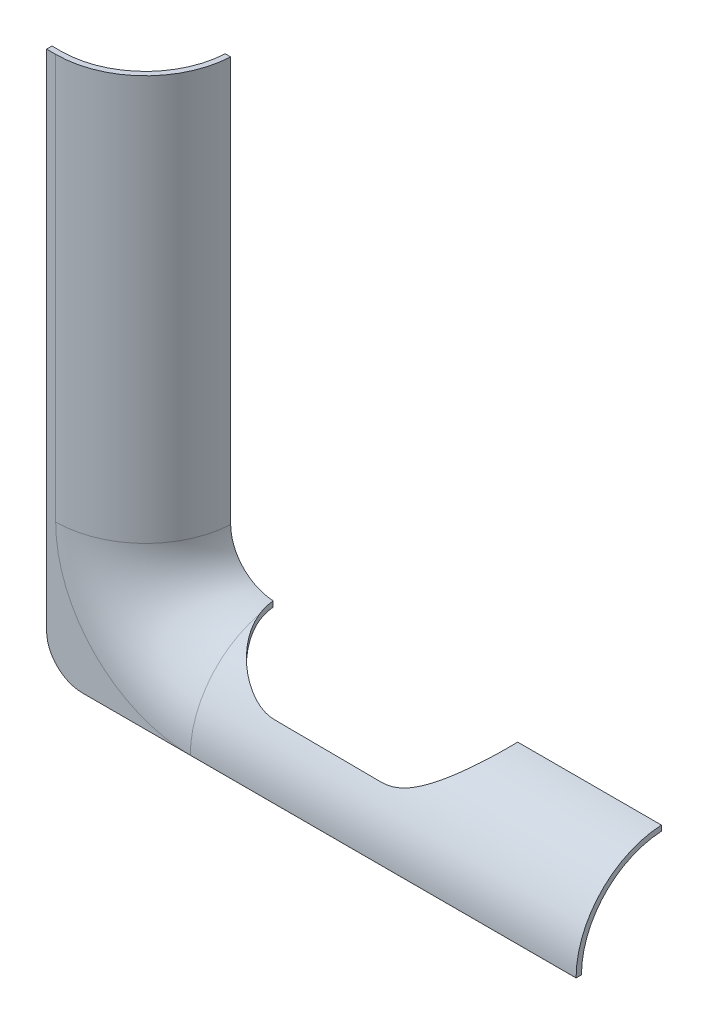
ISO-10303-21;
HEADER;
FILE_DESCRIPTION(('STEP AP214'),'2;1');
FILE_NAME('part.step','',(''),(''),'','','');
FILE_SCHEMA(('AUTOMOTIVE_DESIGN { 1 0 10303 214 1 1 1 1 }'));
ENDSEC;
DATA;
#1=APPLICATION_CONTEXT('core data for automotive mechanical design processes');
#2=APPLICATION_PROTOCOL_DEFINITION('international standard','automotive_design',2000,#1);
#3=PRODUCT_CONTEXT('',#1,'mechanical');
#4=PRODUCT('Part','Part','',(#3));
#5=PRODUCT_RELATED_PRODUCT_CATEGORY('part','',(#4));
#6=PRODUCT_DEFINITION_FORMATION('','',#4);
#7=PRODUCT_DEFINITION_CONTEXT('part definition',#1,'design');
#8=PRODUCT_DEFINITION('design','',#6,#7);
#9=PRODUCT_DEFINITION_SHAPE('','',#8);
#10=(LENGTH_UNIT() NAMED_UNIT(*) SI_UNIT(.MILLI.,.METRE.));
#11=(NAMED_UNIT(*) PLANE_ANGLE_UNIT() SI_UNIT($,.RADIAN.));
#12=(NAMED_UNIT(*) SI_UNIT($,.STERADIAN.) SOLID_ANGLE_UNIT());
#13=UNCERTAINTY_MEASURE_WITH_UNIT(LENGTH_MEASURE(1.E-05),#10,'distance_accuracy_value','');
#14=(GEOMETRIC_REPRESENTATION_CONTEXT(3) GLOBAL_UNCERTAINTY_ASSIGNED_CONTEXT((#13)) GLOBAL_UNIT_ASSIGNED_CONTEXT((#10,
#11,#12)) REPRESENTATION_CONTEXT('',''));
#15=CARTESIAN_POINT('',(0.,0.,0.));
#16=DIRECTION('',(0.,0.,1.));
#17=DIRECTION('',(1.,0.,0.));
#18=AXIS2_PLACEMENT_3D('',#15,#16,#17);
#19=CARTESIAN_POINT('',(-72.7315150821701,-736.702863061255,0.));
#20=DIRECTION('',(0.,0.,1.));
#21=DIRECTION('',(1.,0.,0.));
#22=AXIS2_PLACEMENT_3D('',#19,#20,#21);
#23=PLANE('',#22);
#24=CARTESIAN_POINT('',(-48.7380579076772,-714.702863061255,0.));
#25=DIRECTION('',(0.,0.,1.));
#26=DIRECTION('',(1.,0.,0.));
#27=AXIS2_PLACEMENT_3D('',#24,#25,#26);
#28=CIRCLE('',#27,10.);
#29=CARTESIAN_POINT('',(-58.7380579076772,-714.702863061255,0.));
#30=VERTEX_POINT('',#29);
#31=CARTESIAN_POINT('',(-49.2608688373416,-724.689187146313,0.));
#32=VERTEX_POINT('',#31);
#33=EDGE_CURVE('E306',#30,#32,#28,.T.);
#34=ORIENTED_EDGE('',*,*,#33,.T.);
#35=DIRECTION('',(0.,1.,0.));
#36=VECTOR('',#35,1.);
#37=CARTESIAN_POINT('',(-49.2608688373416,-744.703863061255,0.));
#38=LINE('',#37,#36);
#39=CARTESIAN_POINT('',(-49.2608688373416,-725.892254801583,0.));
#40=VERTEX_POINT('',#39);
#41=EDGE_CURVE('E176',#32,#40,#38,.F.);
#42=ORIENTED_EDGE('',*,*,#41,.T.);
#43=CARTESIAN_POINT('',(-48.7380579076772,-714.702863061255,0.));
#44=DIRECTION('',(0.,0.,1.));
#45=DIRECTION('',(1.,0.,0.));
#46=AXIS2_PLACEMENT_3D('',#43,#44,#45);
#47=CIRCLE('',#46,11.2015989388438);
#48=CARTESIAN_POINT('',(-59.939656846521,-714.702863061255,0.));
#49=VERTEX_POINT('',#48);
#50=EDGE_CURVE('E240',#49,#40,#47,.T.);
#51=ORIENTED_EDGE('',*,*,#50,.F.);
#52=DIRECTION('',(0.,1.,0.));
#53=VECTOR('',#52,1.);
#54=CARTESIAN_POINT('',(-59.939656846521,-714.702863061255,0.));
#55=LINE('',#54,#53);
#56=CARTESIAN_POINT('',(-59.939656846521,-624.514694799975,0.));
#57=VERTEX_POINT('',#56);
#58=EDGE_CURVE('E253',#49,#57,#55,.T.);
#59=ORIENTED_EDGE('',*,*,#58,.T.);
#60=DIRECTION('',(-1.,0.,0.));
#61=VECTOR('',#60,1.);
#62=CARTESIAN_POINT('',(-80.7315150821701,-624.514694799975,0.));
#63=LINE('',#62,#61);
#64=CARTESIAN_POINT('',(-58.7380579076772,-624.514694799975,0.));
#65=VERTEX_POINT('',#64);
#66=EDGE_CURVE('E275',#65,#57,#63,.T.);
#67=ORIENTED_EDGE('',*,*,#66,.F.);
#68=DIRECTION('',(0.,1.,0.));
#69=VECTOR('',#68,1.);
#70=CARTESIAN_POINT('',(-58.7380579076772,-724.702863061255,0.));
#71=LINE('',#70,#69);
#72=EDGE_CURVE('E290',#30,#65,#71,.T.);
#73=ORIENTED_EDGE('',*,*,#72,.F.);
#74=EDGE_LOOP('',(#34,#42,#51,#59,#67,#73));
#75=FACE_BOUND('',#74,.T.);
#76=ADVANCED_FACE('F34',(#75),#23,.F.);
#77=CARTESIAN_POINT('',(37.1804849178299,-744.702863061255,19.));
#78=DIRECTION('',(-1.,0.,0.));
#79=DIRECTION('',(0.,0.,1.));
#80=AXIS2_PLACEMENT_3D('',#77,#78,#79);
#81=PLANE('',#80);
#82=CARTESIAN_POINT('',(37.1804849178299,-744.677847416693,-0.999999999999994));
#83=DIRECTION('',(-1.,0.,0.));
#84=DIRECTION('',(0.,0.,1.));
#85=AXIS2_PLACEMENT_3D('',#82,#83,#84);
#86=CIRCLE('',#85,18.8);
#87=CARTESIAN_POINT('',(37.1804849178299,-725.904462000098,0.));
#88=VERTEX_POINT('',#87);
#89=CARTESIAN_POINT('',(37.1804849178299,-744.677847416693,17.8));
#90=VERTEX_POINT('',#89);
#91=EDGE_CURVE('E252',#88,#90,#86,.F.);
#92=ORIENTED_EDGE('',*,*,#91,.F.);
#93=DIRECTION('',(0.,1.,0.));
#94=VECTOR('',#93,1.);
#95=CARTESIAN_POINT('',(37.1804849178299,-744.702863061255,0.));
#96=LINE('',#95,#94);
#97=CARTESIAN_POINT('',(37.1804849178299,-724.702863061255,0.));
#98=VERTEX_POINT('',#97);
#99=EDGE_CURVE('E284',#88,#98,#96,.T.);
#100=ORIENTED_EDGE('',*,*,#99,.T.);
#101=CARTESIAN_POINT('',(37.1804849178299,-744.677847416693,-0.999999999999994));
#102=DIRECTION('',(-1.,0.,0.));
#103=DIRECTION('',(0.,0.,1.));
#104=AXIS2_PLACEMENT_3D('',#101,#102,#103);
#105=CIRCLE('',#104,20.);
#106=CARTESIAN_POINT('',(37.1804849178299,-744.677847416693,19.));
#107=VERTEX_POINT('',#106);
#108=EDGE_CURVE('E49',#98,#107,#105,.F.);
#109=ORIENTED_EDGE('',*,*,#108,.T.);
#110=DIRECTION('',(0.,1.,0.));
#111=VECTOR('',#110,1.);
#112=CARTESIAN_POINT('',(37.1804849178299,-744.702863061255,19.));
#113=LINE('',#112,#111);
#114=CARTESIAN_POINT('',(37.1804849178299,-744.702863061255,19.));
#115=VERTEX_POINT('',#114);
#116=EDGE_CURVE('E271',#115,#107,#113,.T.);
#117=ORIENTED_EDGE('',*,*,#116,.F.);
#118=DIRECTION('',(0.,0.,-1.));
#119=VECTOR('',#118,1.);
#120=CARTESIAN_POINT('',(37.1804849178299,-744.702863061255,19.));
#121=LINE('',#120,#119);
#122=CARTESIAN_POINT('',(37.1804849178299,-744.702863061255,17.8));
#123=VERTEX_POINT('',#122);
#124=EDGE_CURVE('E283',#115,#123,#121,.T.);
#125=ORIENTED_EDGE('',*,*,#124,.T.);
#126=DIRECTION('',(0.,1.,0.));
#127=VECTOR('',#126,1.);
#128=CARTESIAN_POINT('',(37.1804849178299,-744.702863061255,17.8));
#129=LINE('',#128,#127);
#130=EDGE_CURVE('E250',#123,#90,#129,.T.);
#131=ORIENTED_EDGE('',*,*,#130,.T.);
#132=EDGE_LOOP('',(#92,#100,#109,#117,#125,#131));
#133=FACE_BOUND('',#132,.T.);
#134=ADVANCED_FACE('F364',(#133),#81,.F.);
#135=CARTESIAN_POINT('',(-80.7315150821701,-624.514694799975,19.));
#136=DIRECTION('',(0.,-1.,0.));
#137=DIRECTION('',(0.,0.,-1.));
#138=AXIS2_PLACEMENT_3D('',#135,#136,#137);
#139=PLANE('',#138);
#140=CARTESIAN_POINT('',(-78.7130422631154,-624.514694799975,-0.999999999999994));
#141=DIRECTION('',(0.,-1.,0.));
#142=DIRECTION('',(0.,0.,-1.));
#143=AXIS2_PLACEMENT_3D('',#140,#141,#142);
#144=CIRCLE('',#143,18.8);
#145=CARTESIAN_POINT('',(-78.7130422631154,-624.514694799975,17.8));
#146=VERTEX_POINT('',#145);
#147=EDGE_CURVE('E238',#146,#57,#144,.F.);
#148=ORIENTED_EDGE('',*,*,#147,.F.);
#149=DIRECTION('',(-1.,0.,0.));
#150=VECTOR('',#149,1.);
#151=CARTESIAN_POINT('',(-80.7315150821701,-624.514694799975,17.8));
#152=LINE('',#151,#150);
#153=CARTESIAN_POINT('',(-80.7315150821701,-624.514694799975,17.8));
#154=VERTEX_POINT('',#153);
#155=EDGE_CURVE('E246',#146,#154,#152,.T.);
#156=ORIENTED_EDGE('',*,*,#155,.T.);
#157=DIRECTION('',(0.,0.,-1.));
#158=VECTOR('',#157,1.);
#159=CARTESIAN_POINT('',(-80.7315150821701,-624.514694799975,19.));
#160=LINE('',#159,#158);
#161=CARTESIAN_POINT('',(-80.7315150821701,-624.514694799975,19.));
#162=VERTEX_POINT('',#161);
#163=EDGE_CURVE('E303',#162,#154,#160,.T.);
#164=ORIENTED_EDGE('',*,*,#163,.F.);
#165=DIRECTION('',(-1.,0.,0.));
#166=VECTOR('',#165,1.);
#167=CARTESIAN_POINT('',(-80.7315150821701,-624.514694799975,19.));
#168=LINE('',#167,#166);
#169=CARTESIAN_POINT('',(-78.7130422631154,-624.514694799975,19.));
#170=VERTEX_POINT('',#169);
#171=EDGE_CURVE('E274',#170,#162,#168,.T.);
#172=ORIENTED_EDGE('',*,*,#171,.F.);
#173=CARTESIAN_POINT('',(-78.7130422631154,-624.514694799975,-0.999999999999994));
#174=DIRECTION('',(0.,-1.,0.));
#175=DIRECTION('',(0.,0.,-1.));
#176=AXIS2_PLACEMENT_3D('',#173,#174,#175);
#177=CIRCLE('',#176,20.);
#178=EDGE_CURVE('E314',#170,#65,#177,.F.);
#179=ORIENTED_EDGE('',*,*,#178,.T.);
#180=ORIENTED_EDGE('',*,*,#66,.T.);
#181=EDGE_LOOP('',(#148,#156,#164,#172,#179,#180));
#182=FACE_BOUND('',#181,.T.);
#183=ADVANCED_FACE('F342',(#182),#139,.F.);
#184=CARTESIAN_POINT('',(-80.7315150821701,-736.702863061255,19.));
#185=DIRECTION('',(1.,0.,0.));
#186=DIRECTION('',(0.,0.,-1.));
#187=AXIS2_PLACEMENT_3D('',#184,#185,#186);
#188=PLANE('',#187);
#189=ORIENTED_EDGE('',*,*,#163,.T.);
#190=DIRECTION('',(0.,-1.,0.));
#191=VECTOR('',#190,1.);
#192=CARTESIAN_POINT('',(-80.7315150821701,-736.702863061255,17.8));
#193=LINE('',#192,#191);
#194=CARTESIAN_POINT('',(-80.7315150821701,-736.702863061255,17.8));
#195=VERTEX_POINT('',#194);
#196=EDGE_CURVE('E249',#154,#195,#193,.T.);
#197=ORIENTED_EDGE('',*,*,#196,.T.);
#198=DIRECTION('',(0.,0.,-1.));
#199=VECTOR('',#198,1.);
#200=CARTESIAN_POINT('',(-80.7315150821701,-736.702863061255,19.));
#201=LINE('',#200,#199);
#202=CARTESIAN_POINT('',(-80.7315150821701,-736.702863061255,19.));
#203=VERTEX_POINT('',#202);
#204=EDGE_CURVE('E300',#203,#195,#201,.T.);
#205=ORIENTED_EDGE('',*,*,#204,.F.);
#206=DIRECTION('',(0.,-1.,0.));
#207=VECTOR('',#206,1.);
#208=CARTESIAN_POINT('',(-80.7315150821701,-736.702863061255,19.));
#209=LINE('',#208,#207);
#210=EDGE_CURVE('E277',#162,#203,#209,.T.);
#211=ORIENTED_EDGE('',*,*,#210,.F.);
#212=EDGE_LOOP('',(#189,#197,#205,#211));
#213=FACE_BOUND('',#212,.T.);
#214=ADVANCED_FACE('F352',(#213),#188,.F.);
#215=CARTESIAN_POINT('',(-72.7315150821701,-736.702863061255,19.));
#216=DIRECTION('',(0.,0.,-1.));
#217=DIRECTION('',(-1.,0.,0.));
#218=AXIS2_PLACEMENT_3D('',#215,#216,#217);
#219=CYLINDRICAL_SURFACE('',#218,8.00000000000001);
#220=ORIENTED_EDGE('',*,*,#204,.T.);
#221=CARTESIAN_POINT('',(-72.7315150821701,-736.702863061255,17.8));
#222=DIRECTION('',(0.,0.,1.));
#223=DIRECTION('',(1.,0.,0.));
#224=AXIS2_PLACEMENT_3D('',#221,#222,#223);
#225=CIRCLE('',#224,8.00000000000001);
#226=CARTESIAN_POINT('',(-72.7315150821701,-744.702863061255,17.8));
#227=VERTEX_POINT('',#226);
#228=EDGE_CURVE('E266',#195,#227,#225,.T.);
#229=ORIENTED_EDGE('',*,*,#228,.T.);
#230=DIRECTION('',(0.,0.,-1.));
#231=VECTOR('',#230,1.);
#232=CARTESIAN_POINT('',(-72.7315150821701,-744.702863061255,19.));
#233=LINE('',#232,#231);
#234=CARTESIAN_POINT('',(-72.7315150821701,-744.702863061255,19.));
#235=VERTEX_POINT('',#234);
#236=EDGE_CURVE('E297',#235,#227,#233,.T.);
#237=ORIENTED_EDGE('',*,*,#236,.F.);
#238=CARTESIAN_POINT('',(-72.7315150821701,-736.702863061255,19.));
#239=DIRECTION('',(0.,0.,1.));
#240=DIRECTION('',(1.,0.,0.));
#241=AXIS2_PLACEMENT_3D('',#238,#239,#240);
#242=CIRCLE('',#241,8.00000000000001);
#243=EDGE_CURVE('E279',#203,#235,#242,.T.);
#244=ORIENTED_EDGE('',*,*,#243,.F.);
#245=EDGE_LOOP('',(#220,#229,#237,#244));
#246=FACE_BOUND('',#245,.T.);
#247=ADVANCED_FACE('F358',(#246),#219,.T.);
#248=CARTESIAN_POINT('',(37.1804849178299,-744.702863061255,19.));
#249=DIRECTION('',(0.,1.,0.));
#250=DIRECTION('',(0.,0.,1.));
#251=AXIS2_PLACEMENT_3D('',#248,#249,#250);
#252=PLANE('',#251);
#253=ORIENTED_EDGE('',*,*,#236,.T.);
#254=DIRECTION('',(1.,0.,0.));
#255=VECTOR('',#254,1.);
#256=CARTESIAN_POINT('',(37.1804849178299,-744.702863061255,17.8));
#257=LINE('',#256,#255);
#258=EDGE_CURVE('E258',#227,#123,#257,.T.);
#259=ORIENTED_EDGE('',*,*,#258,.T.);
#260=ORIENTED_EDGE('',*,*,#124,.F.);
#261=DIRECTION('',(1.,0.,0.));
#262=VECTOR('',#261,1.);
#263=CARTESIAN_POINT('',(37.1804849178299,-744.702863061255,19.));
#264=LINE('',#263,#262);
#265=EDGE_CURVE('E281',#235,#115,#264,.T.);
#266=ORIENTED_EDGE('',*,*,#265,.F.);
#267=EDGE_LOOP('',(#253,#259,#260,#266));
#268=FACE_BOUND('',#267,.T.);
#269=ADVANCED_FACE('F360',(#268),#252,.F.);
#270=CARTESIAN_POINT('',(-72.7315150821701,-736.702863061255,19.));
#271=DIRECTION('',(0.,0.,1.));
#272=DIRECTION('',(1.,0.,0.));
#273=AXIS2_PLACEMENT_3D('',#270,#271,#272);
#274=PLANE('',#273);
#275=CARTESIAN_POINT('',(-48.7380579076772,-714.702863061255,19.));
#276=DIRECTION('',(0.,0.,1.));
#277=DIRECTION('',(1.,0.,0.));
#278=AXIS2_PLACEMENT_3D('',#275,#276,#277);
#279=CIRCLE('',#278,29.9749843554382);
#280=CARTESIAN_POINT('',(-48.7380579076772,-744.677847416693,19.));
#281=VERTEX_POINT('',#280);
#282=CARTESIAN_POINT('',(-78.7130422631154,-714.702863061255,19.));
#283=VERTEX_POINT('',#282);
#284=EDGE_CURVE('E63',#281,#283,#279,.F.);
#285=ORIENTED_EDGE('',*,*,#284,.T.);
#286=DIRECTION('',(0.,-1.,0.));
#287=VECTOR('',#286,1.);
#288=CARTESIAN_POINT('',(-78.7130422631154,-624.514694799975,19.));
#289=LINE('',#288,#287);
#290=EDGE_CURVE('E312',#283,#170,#289,.F.);
#291=ORIENTED_EDGE('',*,*,#290,.T.);
#292=ORIENTED_EDGE('',*,*,#171,.T.);
#293=ORIENTED_EDGE('',*,*,#210,.T.);
#294=ORIENTED_EDGE('',*,*,#243,.T.);
#295=ORIENTED_EDGE('',*,*,#265,.T.);
#296=ORIENTED_EDGE('',*,*,#116,.T.);
#297=DIRECTION('',(1.,0.,0.));
#298=VECTOR('',#297,1.);
#299=CARTESIAN_POINT('',(-48.7380579076772,-744.677847416693,19.));
#300=LINE('',#299,#298);
#301=EDGE_CURVE('E309',#107,#281,#300,.F.);
#302=ORIENTED_EDGE('',*,*,#301,.T.);
#303=EDGE_LOOP('',(#285,#291,#292,#293,#294,#295,#296,#302));
#304=FACE_BOUND('',#303,.T.);
#305=ADVANCED_FACE('F348',(#304),#274,.T.);
#306=DIRECTION('',(-1.,0.,0.));
#307=VECTOR('',#306,1.);
#308=CARTESIAN_POINT('',(37.1804849178299,-725.904462000098,0.));
#309=LINE('',#308,#307);
#310=CARTESIAN_POINT('',(5.16218971367192,-725.904462000098,0.));
#311=VERTEX_POINT('',#310);
#312=EDGE_CURVE('E243',#88,#311,#309,.T.);
#313=ORIENTED_EDGE('',*,*,#312,.T.);
#314=DIRECTION('',(0.,1.,0.));
#315=VECTOR('',#314,1.);
#316=CARTESIAN_POINT('',(5.16218971367192,-744.703863061255,0.));
#317=LINE('',#316,#315);
#318=CARTESIAN_POINT('',(5.16218971367192,-724.702863061255,0.));
#319=VERTEX_POINT('',#318);
#320=EDGE_CURVE('E161',#311,#319,#317,.T.);
#321=ORIENTED_EDGE('',*,*,#320,.T.);
#322=DIRECTION('',(-1.,0.,0.));
#323=VECTOR('',#322,1.);
#324=CARTESIAN_POINT('',(37.1804849178299,-724.702863061255,0.));
#325=LINE('',#324,#323);
#326=EDGE_CURVE('E286',#98,#319,#325,.T.);
#327=ORIENTED_EDGE('',*,*,#326,.F.);
#328=ORIENTED_EDGE('',*,*,#99,.F.);
#329=EDGE_LOOP('',(#313,#321,#327,#328));
#330=FACE_BOUND('',#329,.T.);
#331=ADVANCED_FACE('F368',(#330),#23,.F.);
#332=CARTESIAN_POINT('',(37.1804849178299,-744.677847416693,-0.999999999999994));
#333=DIRECTION('',(-1.,0.,0.));
#334=DIRECTION('',(0.,0.,1.));
#335=AXIS2_PLACEMENT_3D('',#332,#333,#334);
#336=CYLINDRICAL_SURFACE('',#335,20.);
#337=CARTESIAN_POINT('',(-48.7380579076772,-725.221319008032,3.63071293463457));
#338=CARTESIAN_POINT('',(-48.6821006434641,-725.270674509101,3.83809862704816));
#339=CARTESIAN_POINT('',(-48.6219545246706,-725.32308658575,4.04357862498637));
#340=CARTESIAN_POINT('',(-48.4935911499175,-725.433686102775,4.45038198392898));
#341=CARTESIAN_POINT('',(-48.4253753207849,-725.49187252188,4.65170607237933));
#342=CARTESIAN_POINT('',(-48.2092778308874,-725.674423044177,5.24840943437157));
#343=CARTESIAN_POINT('',(-48.049768301321,-725.806935711643,5.63717388422005));
#344=CARTESIAN_POINT('',(-47.7040322056308,-726.089316795053,6.39101887799881));
#345=CARTESIAN_POINT('',(-47.5180676665207,-726.239012500033,6.75628592639972));
#346=CARTESIAN_POINT('',(-47.1206341451251,-726.553818470677,7.46582818265693));
#347=CARTESIAN_POINT('',(-46.9091565412088,-726.71893394286,7.81009623481671));
#348=CARTESIAN_POINT('',(-46.4641329290861,-727.060578607706,8.47474060332551));
#349=CARTESIAN_POINT('',(-46.2307160717405,-727.237039282974,8.79523904367414));
#350=CARTESIAN_POINT('',(-45.7426131285411,-727.599238931911,9.41391423703609));
#351=CARTESIAN_POINT('',(-45.4879289280498,-727.784977082542,9.71209296427017));
#352=CARTESIAN_POINT('',(-44.9575245232918,-728.163594962483,10.2870922268785));
#353=CARTESIAN_POINT('',(-44.6817195321594,-728.356501683916,10.563816624236));
#354=CARTESIAN_POINT('',(-44.1110031400521,-728.745615027897,11.0943045684045));
#355=CARTESIAN_POINT('',(-43.8160899423964,-728.941821959466,11.3480659506881));
#356=CARTESIAN_POINT('',(-43.1544536483847,-729.368581657776,11.8747974813786));
#357=CARTESIAN_POINT('',(-42.7841982280555,-729.599133167738,12.1433517594996));
#358=CARTESIAN_POINT('',(-42.0182664864578,-730.054124406735,12.6477889598035));
#359=CARTESIAN_POINT('',(-41.6225800008977,-730.278561640342,12.8836586982558));
#360=CARTESIAN_POINT('',(-40.8064572878048,-730.713283206383,13.3208093039798));
#361=CARTESIAN_POINT('',(-40.3860858787692,-730.923601747883,13.5221757578816));
#362=CARTESIAN_POINT('',(-39.7363681078832,-731.221649098367,13.7969276892118));
#363=CARTESIAN_POINT('',(-39.5166804851065,-731.318063139164,13.8839369440982));
#364=CARTESIAN_POINT('',(-39.070760088691,-731.503744323642,14.0485340698342));
#365=CARTESIAN_POINT('',(-38.8445260339226,-731.593010055353,14.126120080913));
#366=CARTESIAN_POINT('',(-38.347610569128,-731.776909725384,14.2834152728709));
#367=CARTESIAN_POINT('',(-38.0757782756979,-731.869980308811,14.3613441306537));
#368=CARTESIAN_POINT('',(-37.523972171298,-732.041576048207,14.5028068732511));
#369=CARTESIAN_POINT('',(-37.244001647533,-732.120106985129,14.566346481474));
#370=CARTESIAN_POINT('',(-36.6776943987201,-732.259678442119,14.6779161803743));
#371=CARTESIAN_POINT('',(-36.3913823704011,-732.320777142524,14.7259979316611));
#372=CARTESIAN_POINT('',(-35.8131230807748,-732.42325816223,14.8059892453891));
#373=CARTESIAN_POINT('',(-35.5211793886741,-732.464652568407,14.8379087227514));
#374=CARTESIAN_POINT('',(-35.0335644134625,-732.515404838602,14.8768901637436));
#375=CARTESIAN_POINT('',(-34.8388852162896,-732.530869018573,14.8887130487401));
#376=CARTESIAN_POINT('',(-34.4484643121939,-732.55208477073,14.9049033223836));
#377=CARTESIAN_POINT('',(-34.2527216325409,-732.557825020667,14.9092620200212));
#378=CARTESIAN_POINT('',(-34.0569103497205,-732.558547258732,14.9098260104019));
#379=B_SPLINE_CURVE_WITH_KNOTS('',3,(#337,#338,#339,#340,#341,#342,#343,#344,#345,#346,#347,
#348,#349,#350,#351,#352,#353,#354,#355,#356,#357,#358,#359,#360,#361,#362,#363,#364,#365,#366,
#367,#368,#369,#370,#371,#372,#373,#374,#375,#376,#377,#378),.UNSPECIFIED.,.F.,.F.,(4,2,2,2,2,2,
2,2,2,2,2,2,2,2,2,2,2,2,2,2,4),(0.,0.661047679967946,1.32197865253503,2.64176182309358,
3.94928156595841,5.25724440323501,6.55793962715436,7.8585196658421,9.1646260727282,
10.4708554671452,12.0057868515464,13.541335579223,15.0730183770844,15.8383364422019,
16.6038053058608,17.4961737661259,18.3881866557408,19.2771866510128,20.1656406169063,
20.7522287891931,21.3394994987019),.UNSPECIFIED.);
#380=CARTESIAN_POINT('',(-48.7380579076772,-725.221319008032,3.63071293463455));
#381=VERTEX_POINT('',#380);
#382=CARTESIAN_POINT('',(-34.0569103497205,-732.558547258732,14.9098260104019));
#383=VERTEX_POINT('',#382);
#384=EDGE_CURVE('E189',#381,#383,#379,.T.);
#385=ORIENTED_EDGE('',*,*,#384,.F.);
#386=CARTESIAN_POINT('',(-48.7380579076772,-744.677847416693,-0.999999999999994));
#387=DIRECTION('',(-1.,0.,0.));
#388=DIRECTION('',(0.,-1.,0.));
#389=AXIS2_PLACEMENT_3D('',#386,#387,#388);
#390=CIRCLE('',#389,20.);
#391=EDGE_CURVE('E287',#281,#381,#390,.T.);
#392=ORIENTED_EDGE('',*,*,#391,.F.);
#393=ORIENTED_EDGE('',*,*,#301,.F.);
#394=ORIENTED_EDGE('',*,*,#108,.F.);
#395=ORIENTED_EDGE('',*,*,#326,.T.);
#396=CARTESIAN_POINT('',(-10.132917096708,-732.65148829889,14.9801966937096));
#397=CARTESIAN_POINT('',(-9.98896968619073,-732.652058687343,14.9806224605751));
#398=CARTESIAN_POINT('',(-9.84502741587372,-732.649904531165,14.9790051248235));
#399=CARTESIAN_POINT('',(-9.55744273388464,-732.640215604644,14.9717087090655));
#400=CARTESIAN_POINT('',(-9.41380029072918,-732.632681431026,14.9660300795171));
#401=CARTESIAN_POINT('',(-8.98423512949256,-732.602148239813,14.9429666371541));
#402=CARTESIAN_POINT('',(-8.69914440736394,-732.571220108291,14.9195556274956));
#403=CARTESIAN_POINT('',(-8.13734068873796,-732.490205825043,14.8576138525893));
#404=CARTESIAN_POINT('',(-7.86056677979236,-732.440377963997,14.8192867597739));
#405=CARTESIAN_POINT('',(-7.31297524525267,-732.323603335104,14.7282587142486));
#406=CARTESIAN_POINT('',(-7.04216048720816,-732.256648513273,14.6755509982458));
#407=CARTESIAN_POINT('',(-6.41523500329922,-732.082298842363,14.5360400403187));
#408=CARTESIAN_POINT('',(-6.06200570867169,-731.968925751366,14.4437490772));
#409=CARTESIAN_POINT('',(-5.36978493844973,-731.721354776491,14.2366438239235));
#410=CARTESIAN_POINT('',(-5.03079836517961,-731.587149795724,14.1218218544961));
#411=CARTESIAN_POINT('',(-4.36519320709611,-731.302264773426,13.8704439895156));
#412=CARTESIAN_POINT('',(-4.03867382398132,-731.15147940407,13.7337462968338));
#413=CARTESIAN_POINT('',(-3.4003436052288,-730.838772261656,13.4404292741612));
#414=CARTESIAN_POINT('',(-3.08853289125502,-730.676850396507,13.2838097794252));
#415=CARTESIAN_POINT('',(-2.36238497378366,-730.282127445381,12.887709263971));
#416=CARTESIAN_POINT('',(-1.95461501819955,-730.045969105358,12.6394927201474));
#417=CARTESIAN_POINT('',(-1.1662090700667,-729.567842457846,12.1078506930796));
#418=CARTESIAN_POINT('',(-0.785583269428477,-729.325872013178,11.8244120932971));
#419=CARTESIAN_POINT('',(-0.0525351436631387,-728.843277777068,11.22353010858));
#420=CARTESIAN_POINT('',(0.299931330122525,-728.602652450477,10.9061418536698));
#421=CARTESIAN_POINT('',(0.975992730487653,-728.128285152697,10.2374364284768));
#422=CARTESIAN_POINT('',(1.29959667341119,-727.894541047282,9.88612992581103));
#423=CARTESIAN_POINT('',(1.86148408083155,-727.47950217213,9.21489257797679));
#424=CARTESIAN_POINT('',(2.10475127950975,-727.296225859547,8.90034975360369));
#425=CARTESIAN_POINT('',(2.56862821857006,-726.940997013902,8.24887809510724));
#426=CARTESIAN_POINT('',(2.78923844004159,-726.769044240428,7.9119497365599));
#427=CARTESIAN_POINT('',(3.20559015946239,-726.439610972419,7.21672583273913));
#428=CARTESIAN_POINT('',(3.40135151763964,-726.28211894847,6.85844769196947));
#429=CARTESIAN_POINT('',(3.7658506538147,-725.984485090529,6.12151706394128));
#430=CARTESIAN_POINT('',(3.93459428084887,-725.844339502721,5.74286901031925));
#431=CARTESIAN_POINT('',(4.21647693930947,-725.606364421445,5.03275002508254));
#432=CARTESIAN_POINT('',(4.33419321042318,-725.505387754245,4.70414531083401));
#433=CARTESIAN_POINT('',(4.54779320247755,-725.319055655753,4.03562488097756));
#434=CARTESIAN_POINT('',(4.64368105510922,-725.233697268828,3.69571131989612));
#435=CARTESIAN_POINT('',(4.81210746988352,-725.080196505279,3.00703367434067));
#436=CARTESIAN_POINT('',(4.88468924283895,-725.01202231923,2.6582872774669));
#437=CARTESIAN_POINT('',(5.00552796174767,-724.893936133641,1.95369424311285));
#438=CARTESIAN_POINT('',(5.05379828307084,-724.844014096515,1.59785162202422));
#439=CARTESIAN_POINT('',(5.10995799459336,-724.780490909003,1.03421618151798));
#440=CARTESIAN_POINT('',(5.12628972895174,-724.760476942596,0.827936786884035));
#441=CARTESIAN_POINT('',(5.15055230669621,-724.726854137135,0.414527024268438));
#442=CARTESIAN_POINT('',(5.15848966591951,-724.713240334747,0.207397441778848));
#443=CARTESIAN_POINT('',(5.16218971367193,-724.702863061255,0.));
#444=B_SPLINE_CURVE_WITH_KNOTS('',3,(#396,#397,#398,#399,#400,#401,#402,#403,#404,#405,#406,
#407,#408,#409,#410,#411,#412,#413,#414,#415,#416,#417,#418,#419,#420,#421,#422,#423,#424,#425,
#426,#427,#428,#429,#430,#431,#432,#433,#434,#435,#436,#437,#438,#439,#440,#441,#442,#443),
.UNSPECIFIED.,.F.,.F.,(4,2,2,2,2,2,2,2,2,2,2,2,2,2,2,2,2,2,2,2,2,2,2,4),(0.,0.431764985989043,
0.863482090228457,1.72533207670153,2.5758049574867,3.42667851227297,4.5717289697865,
5.71717037620388,6.87036194085416,8.02356304254884,9.61924837188694,11.2155297182208,
12.8092571622968,14.402484986435,15.7148207268216,17.0271285958185,18.3383809206671,
19.6493489891128,20.7383651796231,21.8271750690431,22.9139544272055,24.0001352197922,
24.6235627740998,25.2465060588173),.UNSPECIFIED.);
#445=CARTESIAN_POINT('',(-10.132917096708,-732.65148829889,14.9801966937096));
#446=VERTEX_POINT('',#445);
#447=EDGE_CURVE('E225',#446,#319,#444,.T.);
#448=ORIENTED_EDGE('',*,*,#447,.F.);
#449=CARTESIAN_POINT('',(-5442.93674835016,-744.677847416693,-0.999999999999994));
#450=DIRECTION('',(-0.00294141442618421,0.,0.99999567403123));
#451=DIRECTION('',(-0.99999567403123,0.,-0.00294141442618421));
#452=AXIS2_PLACEMENT_3D('',#449,#450,#451);
#453=ELLIPSE('',#452,6799.4498911686,20.);
#454=EDGE_CURVE('E171',#383,#446,#453,.F.);
#455=ORIENTED_EDGE('',*,*,#454,.F.);
#456=EDGE_LOOP('',(#385,#392,#393,#394,#395,#448,#455));
#457=FACE_BOUND('',#456,.T.);
#458=ADVANCED_FACE('F36',(#457),#336,.T.);
#459=CARTESIAN_POINT('',(-48.7380579076772,-714.702863061255,-0.999999999999994));
#460=DIRECTION('',(0.,0.,1.));
#461=DIRECTION('',(1.,0.,0.));
#462=AXIS2_PLACEMENT_3D('',#459,#460,#461);
#463=TOROIDAL_SURFACE('',#462,29.9749843554382,20.);
#464=CARTESIAN_POINT('',(-49.260873331894,-724.68917688578,-0.0002));
#465=CARTESIAN_POINT('',(-49.2573865713033,-724.697136671819,0.155057187010738));
#466=CARTESIAN_POINT('',(-49.251528389968,-724.707036465576,0.310145548370435));
#467=CARTESIAN_POINT('',(-49.2351077436507,-724.73063623556,0.619774930265174));
#468=CARTESIAN_POINT('',(-49.2245455380563,-724.744336002236,0.774315980506305));
#469=CARTESIAN_POINT('',(-49.1860049935309,-724.790841899451,1.2350927722966));
#470=CARTESIAN_POINT('',(-49.1511322974487,-724.829146302037,1.5402353356302));
#471=CARTESIAN_POINT('',(-49.0634418406001,-724.919354185193,2.14583196179169));
#472=CARTESIAN_POINT('',(-49.0106259578387,-724.971256242448,2.44628651184486));
#473=CARTESIAN_POINT('',(-48.9182640943484,-725.058335864545,2.89327908243464));
#474=CARTESIAN_POINT('',(-48.8851752215261,-725.088999671096,3.04207557512999));
#475=CARTESIAN_POINT('',(-48.814711039735,-725.153168958646,3.3380234487507));
#476=CARTESIAN_POINT('',(-48.7773359736309,-725.186674278612,3.48517492236828));
#477=CARTESIAN_POINT('',(-48.7378579076772,-725.221495414071,3.63145407232464));
#478=B_SPLINE_CURVE_WITH_KNOTS('',3,(#464,#465,#466,#467,#468,#469,#470,#471,#472,#473,#474,
#475,#476,#477),.UNSPECIFIED.,.F.,.F.,(4,2,2,2,2,2,4),(0.,0.466439618016958,0.932853518972717,
1.86042770515427,2.78790483764544,3.25427808113569,3.72062491197973),.UNSPECIFIED.);
#479=EDGE_CURVE('E179',#32,#381,#478,.T.);
#480=ORIENTED_EDGE('',*,*,#479,.F.);
#481=ORIENTED_EDGE('',*,*,#33,.F.);
#482=CARTESIAN_POINT('',(-78.7130422631154,-714.702863061255,-0.999999999999994));
#483=DIRECTION('',(0.,1.,0.));
#484=DIRECTION('',(0.,0.,1.));
#485=AXIS2_PLACEMENT_3D('',#482,#483,#484);
#486=CIRCLE('',#485,20.);
#487=EDGE_CURVE('E261',#283,#30,#486,.T.);
#488=ORIENTED_EDGE('',*,*,#487,.F.);
#489=ORIENTED_EDGE('',*,*,#284,.F.);
#490=ORIENTED_EDGE('',*,*,#391,.T.);
#491=EDGE_LOOP('',(#480,#481,#488,#489,#490));
#492=FACE_BOUND('',#491,.T.);
#493=ADVANCED_FACE('F195',(#492),#463,.T.);
#494=CARTESIAN_POINT('',(-78.7130422631154,-724.702863061255,-0.999999999999994));
#495=DIRECTION('',(0.,1.,0.));
#496=DIRECTION('',(-1.,0.,0.));
#497=AXIS2_PLACEMENT_3D('',#494,#495,#496);
#498=CYLINDRICAL_SURFACE('',#497,20.);
#499=ORIENTED_EDGE('',*,*,#487,.T.);
#500=ORIENTED_EDGE('',*,*,#72,.T.);
#501=ORIENTED_EDGE('',*,*,#178,.F.);
#502=ORIENTED_EDGE('',*,*,#290,.F.);
#503=EDGE_LOOP('',(#499,#500,#501,#502));
#504=FACE_BOUND('',#503,.T.);
#505=ADVANCED_FACE('F345',(#504),#498,.T.);
#506=CARTESIAN_POINT('',(-72.7315150821701,-736.702863061255,17.8));
#507=DIRECTION('',(0.,0.,1.));
#508=DIRECTION('',(1.,0.,0.));
#509=AXIS2_PLACEMENT_3D('',#506,#507,#508);
#510=PLANE('',#509);
#511=CARTESIAN_POINT('',(-48.7380579076772,-714.702863061255,17.8));
#512=DIRECTION('',(0.,0.,1.));
#513=DIRECTION('',(1.,0.,0.));
#514=AXIS2_PLACEMENT_3D('',#511,#512,#513);
#515=CIRCLE('',#514,29.9749843554381);
#516=CARTESIAN_POINT('',(-48.7380579076772,-744.677847416693,17.8));
#517=VERTEX_POINT('',#516);
#518=CARTESIAN_POINT('',(-78.7130422631154,-714.702863061255,17.8));
#519=VERTEX_POINT('',#518);
#520=EDGE_CURVE('E233',#517,#519,#515,.F.);
#521=ORIENTED_EDGE('',*,*,#520,.F.);
#522=DIRECTION('',(1.,0.,0.));
#523=VECTOR('',#522,1.);
#524=CARTESIAN_POINT('',(-72.7315150821701,-744.677847416693,17.8));
#525=LINE('',#524,#523);
#526=EDGE_CURVE('E236',#90,#517,#525,.F.);
#527=ORIENTED_EDGE('',*,*,#526,.F.);
#528=ORIENTED_EDGE('',*,*,#130,.F.);
#529=ORIENTED_EDGE('',*,*,#258,.F.);
#530=ORIENTED_EDGE('',*,*,#228,.F.);
#531=ORIENTED_EDGE('',*,*,#196,.F.);
#532=ORIENTED_EDGE('',*,*,#155,.F.);
#533=DIRECTION('',(0.,1.,0.));
#534=VECTOR('',#533,1.);
#535=CARTESIAN_POINT('',(-78.7130422631154,-736.702863061255,17.8));
#536=LINE('',#535,#534);
#537=EDGE_CURVE('E235',#519,#146,#536,.T.);
#538=ORIENTED_EDGE('',*,*,#537,.F.);
#539=EDGE_LOOP('',(#521,#527,#528,#529,#530,#531,#532,#538));
#540=FACE_BOUND('',#539,.T.);
#541=ADVANCED_FACE('F204',(#540),#510,.F.);
#542=CARTESIAN_POINT('',(37.1804849178299,-744.677847416693,-0.999999999999994));
#543=DIRECTION('',(-1.,0.,0.));
#544=DIRECTION('',(0.,0.,1.));
#545=AXIS2_PLACEMENT_3D('',#542,#543,#544);
#546=CYLINDRICAL_SURFACE('',#545,18.8);
#547=CARTESIAN_POINT('',(-48.7380579076772,-744.677847416693,-0.999999999999994));
#548=DIRECTION('',(-1.,0.,0.));
#549=DIRECTION('',(0.,-1.,0.));
#550=AXIS2_PLACEMENT_3D('',#547,#548,#549);
#551=CIRCLE('',#550,18.8);
#552=CARTESIAN_POINT('',(-48.7380579076772,-726.457076365033,3.63071293463459));
#553=VERTEX_POINT('',#552);
#554=EDGE_CURVE('E241',#517,#553,#551,.T.);
#555=ORIENTED_EDGE('',*,*,#554,.T.);
#556=CARTESIAN_POINT('',(-34.0569103497205,-734.661988176531,14.9098260104019));
#557=CARTESIAN_POINT('',(-34.1898484732052,-734.661376130726,14.9094374516976));
#558=CARTESIAN_POINT('',(-34.3227461502937,-734.657984032969,14.9073055364203));
#559=CARTESIAN_POINT('',(-34.5881687709117,-734.645735916408,14.8995852778988));
#560=CARTESIAN_POINT('',(-34.7206937692419,-734.636880748221,14.8939974727463));
#561=CARTESIAN_POINT('',(-35.1167387392134,-734.602315234518,14.8721275177168));
#562=CARTESIAN_POINT('',(-35.3793297893986,-734.568601207816,14.8507367739751));
#563=CARTESIAN_POINT('',(-35.8957908040571,-734.482236197974,14.7953177469225));
#564=CARTESIAN_POINT('',(-36.1497326164227,-734.429879691605,14.7614857279844));
#565=CARTESIAN_POINT('',(-36.651784315106,-734.308475626922,14.6818810020646));
#566=CARTESIAN_POINT('',(-36.8998907061453,-734.239418331224,14.6361013277735));
#567=CARTESIAN_POINT('',(-37.4902543080518,-734.055793123747,14.5122123450843));
#568=CARTESIAN_POINT('',(-37.829162097192,-733.9341994832,14.4285552760486));
#569=CARTESIAN_POINT('',(-38.4927182057519,-733.669749631993,14.2409989789001));
#570=CARTESIAN_POINT('',(-38.8173605028179,-733.526884550922,14.1370913004644));
#571=CARTESIAN_POINT('',(-39.4552124257467,-733.224522604313,13.9096419796908));
#572=CARTESIAN_POINT('',(-39.7683055650738,-733.064898189923,13.7859453535615));
#573=CARTESIAN_POINT('',(-40.3807822496196,-732.734826583828,13.5206456210721));
#574=CARTESIAN_POINT('',(-40.6801661569779,-732.564379678293,13.3790429880845));
#575=CARTESIAN_POINT('',(-41.409789021925,-732.131047871842,13.0048223090048));
#576=CARTESIAN_POINT('',(-41.8321000090485,-731.863868357393,12.7616539967227));
#577=CARTESIAN_POINT('',(-42.6492055302068,-731.32367013215,12.2381162579982));
#578=CARTESIAN_POINT('',(-43.0439872724544,-731.050648782872,11.9577297110581));
#579=CARTESIAN_POINT('',(-43.8051182912605,-730.506961630516,11.3607714919807));
#580=CARTESIAN_POINT('',(-44.1715277898911,-730.236291984823,11.0442801976331));
#581=CARTESIAN_POINT('',(-44.8755729873432,-729.703200887431,10.3746664528743));
#582=CARTESIAN_POINT('',(-45.2132197087664,-729.44077630058,10.0215581510756));
#583=CARTESIAN_POINT('',(-45.791030724072,-728.98272606387,9.35525328783041));
#584=CARTESIAN_POINT('',(-46.0369440152131,-728.784480058985,9.04882956773042));
#585=CARTESIAN_POINT('',(-46.5075171027478,-728.399841098229,8.41299757648762));
#586=CARTESIAN_POINT('',(-46.732177511139,-728.213447801099,8.08358996766318));
#587=CARTESIAN_POINT('',(-47.1578914215014,-727.85574711639,7.40265958780302));
#588=CARTESIAN_POINT('',(-47.3589709816061,-727.684423129759,7.05116190026293));
#589=CARTESIAN_POINT('',(-47.7353360404579,-727.35973512922,6.32669419020607));
#590=CARTESIAN_POINT('',(-47.9106264863924,-727.206367671823,5.95372830513335));
#591=CARTESIAN_POINT('',(-48.2038594484917,-726.946298054986,5.25657386245449));
#592=CARTESIAN_POINT('',(-48.3264499412619,-726.836158103715,4.93561718882375));
#593=CARTESIAN_POINT('',(-48.550897380322,-726.63175346259,4.2816468357598));
#594=CARTESIAN_POINT('',(-48.6527583749636,-726.537485673616,3.94863552551961));
#595=CARTESIAN_POINT('',(-48.8342418499316,-726.36641113562,3.27234169187029));
#596=CARTESIAN_POINT('',(-48.9138727966877,-726.289597741081,2.92906313409552));
#597=CARTESIAN_POINT('',(-49.0496120547766,-726.154754081939,2.23422920748403));
#598=CARTESIAN_POINT('',(-49.1057200935923,-726.096724034947,1.88267374280763));
#599=CARTESIAN_POINT('',(-49.1935426054882,-726.000295664631,1.17213881008808));
#600=CARTESIAN_POINT('',(-49.2251413258294,-725.96199078182,0.813132237654437));
#601=CARTESIAN_POINT('',(-49.2627906772722,-725.906116086601,0.0921644027975789));
#602=CARTESIAN_POINT('',(-49.2688412490275,-725.888546322359,-0.269796866487184));
#603=CARTESIAN_POINT('',(-49.255127760821,-725.87436429304,-0.99360640226183));
#604=CARTESIAN_POINT('',(-49.2353660554655,-725.87775011649,-1.35545467604764));
#605=CARTESIAN_POINT('',(-49.1702388672923,-725.905203901663,-2.07602973959471));
#606=CARTESIAN_POINT('',(-49.1248744687188,-725.929270987579,-2.43475666088842));
#607=CARTESIAN_POINT('',(-49.0135247333066,-725.994794278322,-3.11965068616753));
#608=CARTESIAN_POINT('',(-48.9493309251723,-726.034818745834,-3.44624980818462));
#609=CARTESIAN_POINT('',(-48.8003971850776,-726.131027827635,-4.09226862230802));
#610=CARTESIAN_POINT('',(-48.7156584874305,-726.187211471136,-4.41168874446113));
#611=CARTESIAN_POINT('',(-48.5266219162451,-726.314613588105,-5.04165162631912));
#612=CARTESIAN_POINT('',(-48.4223207537286,-726.38583459001,-5.35219288311458));
#613=CARTESIAN_POINT('',(-48.1952927562974,-726.542000481379,-5.96290417288875));
#614=CARTESIAN_POINT('',(-48.0725648505354,-726.626946168457,-6.26307360187361));
#615=CARTESIAN_POINT('',(-47.7999266657736,-726.816036256416,-6.87414461307722));
#616=CARTESIAN_POINT('',(-47.6486630011551,-726.921146461379,-7.18414264288347));
#617=CARTESIAN_POINT('',(-47.3276215573357,-727.143776008316,-7.78973056353156));
#618=CARTESIAN_POINT('',(-47.1578430507021,-727.261295837848,-8.08531988760677));
#619=CARTESIAN_POINT('',(-46.8011162973783,-727.506890819301,-8.66135018597065));
#620=CARTESIAN_POINT('',(-46.6141674000486,-727.634966371192,-8.94179058557939));
#621=CARTESIAN_POINT('',(-46.2242965925855,-727.899823616824,-9.48703759681405));
#622=CARTESIAN_POINT('',(-46.0213725398521,-728.036606477924,-9.75184210297836));
#623=CARTESIAN_POINT('',(-45.5597040157979,-728.34427557363,-10.3153919371843));
#624=CARTESIAN_POINT('',(-45.2977746790212,-728.516624073084,-10.6107344776188));
#625=CARTESIAN_POINT('',(-44.754029042076,-728.867924979016,-11.17829878424));
#626=CARTESIAN_POINT('',(-44.4722099668597,-729.046878305341,-11.4505173124059));
#627=CARTESIAN_POINT('',(-43.8890472327014,-729.408509190977,-11.9721577522762));
#628=CARTESIAN_POINT('',(-43.5876602743613,-729.591194350842,-12.2215259451656));
#629=CARTESIAN_POINT('',(-42.9665810859014,-729.956345501359,-12.6964560042352));
#630=CARTESIAN_POINT('',(-42.646889795618,-730.138811502773,-12.9220190910011));
#631=CARTESIAN_POINT('',(-41.9975642223573,-730.495134352201,-13.3436188303419));
#632=CARTESIAN_POINT('',(-41.6683698337715,-730.669092537078,-13.5402466445232));
#633=CARTESIAN_POINT('',(-40.9927637244706,-731.00883291236,-13.9097254956964));
#634=CARTESIAN_POINT('',(-40.6463507988214,-731.174614528957,-14.0825748655012));
#635=CARTESIAN_POINT('',(-39.9383523270218,-731.49202297551,-14.4024061747532));
#636=CARTESIAN_POINT('',(-39.576868324471,-731.643727526635,-14.5495346737126));
#637=CARTESIAN_POINT('',(-38.8369952747592,-731.928191425754,-14.8175422858782));
#638=CARTESIAN_POINT('',(-38.4586090556011,-732.060953927572,-14.938425770594));
#639=CARTESIAN_POINT('',(-37.7500317065965,-732.280876276688,-15.1341100931546));
#640=CARTESIAN_POINT('',(-37.4222515986345,-732.371947452087,-15.213228395554));
#641=CARTESIAN_POINT('',(-36.7570676139588,-732.532004222143,-15.3502492706307));
#642=CARTESIAN_POINT('',(-36.4196705363136,-732.601005018183,-15.4081664499643));
#643=CARTESIAN_POINT('',(-35.9055626214751,-732.685558870335,-15.4784790233617));
#644=CARTESIAN_POINT('',(-35.7315052587289,-732.710702278967,-15.4992488308895));
#645=CARTESIAN_POINT('',(-35.381901395121,-732.753949292613,-15.5348354817942));
#646=CARTESIAN_POINT('',(-35.2063549512188,-732.772053165668,-15.5496525518328));
#647=CARTESIAN_POINT('',(-34.8538021767269,-732.800935558941,-15.5732403376303));
#648=CARTESIAN_POINT('',(-34.6767932638537,-732.811695267812,-15.5819955273024));
#649=CARTESIAN_POINT('',(-34.3222454159403,-732.825653751437,-15.5933377509475));
#650=CARTESIAN_POINT('',(-34.1447063800465,-732.828850981737,-15.5959235249668));
#651=CARTESIAN_POINT('',(-33.9671814719358,-732.828184148999,-15.5953924387894));
#652=B_SPLINE_CURVE_WITH_KNOTS('',3,(#556,#557,#558,#559,#560,#561,#562,#563,#564,#565,#566,
#567,#568,#569,#570,#571,#572,#573,#574,#575,#576,#577,#578,#579,#580,#581,#582,#583,#584,#585,
#586,#587,#588,#589,#590,#591,#592,#593,#594,#595,#596,#597,#598,#599,#600,#601,#602,#603,#604,
#605,#606,#607,#608,#609,#610,#611,#612,#613,#614,#615,#616,#617,#618,#619,#620,#621,#622,#623,
#624,#625,#626,#627,#628,#629,#630,#631,#632,#633,#634,#635,#636,#637,#638,#639,#640,#641,#642,
#643,#644,#645,#646,#647,#648,#649,#650,#651),.UNSPECIFIED.,.F.,.F.,(4,2,2,2,2,2,2,2,2,2,2,2,2,
2,2,2,2,2,2,2,2,2,2,2,2,2,2,2,2,2,2,2,2,2,2,2,2,2,2,2,2,2,2,2,2,2,2,4),(0.,0.398737181256401,
0.797412293636536,1.59296686125913,2.37647500536124,3.16044107939375,4.26757870947183,
5.37517932710922,6.49192233548654,7.60863582723312,9.27366952748131,10.9394718197298,
12.601635462188,14.263159229991,15.5822493107001,16.9013013953564,18.2188818385966,
19.5362091967451,20.6175357192152,21.6986508617578,22.7793536924727,23.8600690429853,
24.9458578384741,26.0316491561531,27.1173414344258,28.2029877383448,29.2076152369471,
30.2121823936363,31.2169185968173,32.2217132116128,33.3024507776596,34.3832308202858,
35.4640518339418,36.5450180559193,37.8360232223229,39.127208869269,40.4213560044489,
41.7154367511029,42.9775908250559,44.2398333478487,45.4946308349765,46.7492191557169,
47.7957956492639,48.8416497337466,49.3727030693812,49.9037361822477,50.4361244301538,
50.9686213961608),.UNSPECIFIED.);
#653=CARTESIAN_POINT('',(-34.0569103497205,-734.661988176531,14.9098260104019));
#654=VERTEX_POINT('',#653);
#655=EDGE_CURVE('E56',#654,#553,#652,.T.);
#656=ORIENTED_EDGE('',*,*,#655,.F.);
#657=CARTESIAN_POINT('',(-5442.93674835016,-744.677847416693,-0.999999999999994));
#658=DIRECTION('',(-0.00294141442618421,0.,0.99999567403123));
#659=DIRECTION('',(-0.99999567403123,0.,-0.00294141442618421));
#660=AXIS2_PLACEMENT_3D('',#657,#658,#659);
#661=ELLIPSE('',#660,6391.48289769849,18.8);
#662=CARTESIAN_POINT('',(-10.132917096708,-734.774650274842,14.9801966937096));
#663=VERTEX_POINT('',#662);
#664=EDGE_CURVE('E169',#663,#654,#661,.T.);
#665=ORIENTED_EDGE('',*,*,#664,.F.);
#666=CARTESIAN_POINT('',(-10.0431882189233,-732.742029765489,-15.5250217554817));
#667=CARTESIAN_POINT('',(-9.86443216797244,-732.741413311922,-15.5245048171031));
#668=CARTESIAN_POINT('',(-9.68570934973284,-732.736926687106,-15.5208280433272));
#669=CARTESIAN_POINT('',(-9.32888869249242,-732.720399467322,-15.5072269127734));
#670=CARTESIAN_POINT('',(-9.15079072777386,-732.70836049127,-15.4973038949353));
#671=CARTESIAN_POINT('',(-8.79615622598121,-732.676954811592,-15.4713154244757));
#672=CARTESIAN_POINT('',(-8.61961685709564,-732.65760696565,-15.4552657781165));
#673=CARTESIAN_POINT('',(-8.26811022979559,-732.611921640258,-15.41715352604));
#674=CARTESIAN_POINT('',(-8.09314303743959,-732.585583868518,-15.3950906688734));
#675=CARTESIAN_POINT('',(-7.57633110218284,-732.497559400028,-15.3208406917301));
#676=CARTESIAN_POINT('',(-7.23725228543821,-732.426366415358,-15.2601927519802));
#677=CARTESIAN_POINT('',(-6.5689345418813,-732.262224155362,-15.1175091846631));
#678=CARTESIAN_POINT('',(-6.23970280795823,-732.169259394195,-15.0354583288691));
#679=CARTESIAN_POINT('',(-5.51784840647491,-731.942289070459,-14.8301845942598));
#680=CARTESIAN_POINT('',(-5.12810943782211,-731.80376290889,-14.7018308276659));
#681=CARTESIAN_POINT('',(-4.36668891103714,-731.507405436619,-14.417214878552));
#682=CARTESIAN_POINT('',(-3.99501103089389,-731.349570216618,-14.2609470416112));
#683=CARTESIAN_POINT('',(-3.26768268622319,-731.019897338683,-13.9211754735174));
#684=CARTESIAN_POINT('',(-2.91214297894071,-730.847980632995,-13.7375124540806));
#685=CARTESIAN_POINT('',(-2.21949284734175,-730.496366271759,-13.3448396531956));
#686=CARTESIAN_POINT('',(-1.88238098475568,-730.316669225424,-13.1358318539845));
#687=CARTESIAN_POINT('',(-1.21854432704303,-729.949546932341,-12.6877338014615));
#688=CARTESIAN_POINT('',(-0.892278946208117,-729.762040312621,-12.4480300867612));
#689=CARTESIAN_POINT('',(-0.259512790924019,-729.387827205612,-11.9432181192311));
#690=CARTESIAN_POINT('',(0.0469871787882937,-729.20112075119,-11.6781088331195));
#691=CARTESIAN_POINT('',(0.638749191684938,-728.832740856573,-11.1233998583437));
#692=CARTESIAN_POINT('',(0.924055541651356,-728.651057445275,-10.8338541293388));
#693=CARTESIAN_POINT('',(1.47287089930523,-728.295909115389,-10.23009959882));
#694=CARTESIAN_POINT('',(1.73638188866852,-728.122443450241,-9.91589304458938));
#695=CARTESIAN_POINT('',(2.21779601122037,-727.801945995491,-9.29192069359598));
#696=CARTESIAN_POINT('',(2.43767219010687,-727.653930283052,-8.98418403939339));
#697=CARTESIAN_POINT('',(2.85621796666638,-727.370331230259,-8.34920065546111));
#698=CARTESIAN_POINT('',(3.05489114992392,-727.234745788402,-8.02195723910441));
#699=CARTESIAN_POINT('',(3.42924177935968,-726.978624149967,-7.34879445946863));
#700=CARTESIAN_POINT('',(3.60491448926231,-726.858091053215,-7.00287127028493));
#701=CARTESIAN_POINT('',(3.93117737561946,-726.634748665609,-6.29383723406929));
#702=CARTESIAN_POINT('',(4.08176761851296,-726.531939327807,-5.93072643256753));
#703=CARTESIAN_POINT('',(4.35703073249139,-726.345727695443,-5.18593406713319));
#704=CARTESIAN_POINT('',(4.4814535262386,-726.262511824518,-4.80411284590124));
#705=CARTESIAN_POINT('',(4.70059175226234,-726.119066138454,-4.02777427646638));
#706=CARTESIAN_POINT('',(4.79530684623451,-726.058836585075,-3.6332567837377));
#707=CARTESIAN_POINT('',(4.9532404976062,-725.963344230752,-2.8353818555886));
#708=CARTESIAN_POINT('',(5.01649041420189,-725.928056557114,-2.43203364151908));
#709=CARTESIAN_POINT('',(5.11045320064864,-725.883683980555,-1.62015930054659));
#710=CARTESIAN_POINT('',(5.1411715921527,-725.87459463048,-1.2116340642678));
#711=CARTESIAN_POINT('',(5.16750344063125,-725.882529579518,-0.454921358077999));
#712=CARTESIAN_POINT('',(5.16767732601325,-725.89585411643,-0.106841183216058));
#713=CARTESIAN_POINT('',(5.1443357830045,-725.941742004639,0.587217973734133));
#714=CARTESIAN_POINT('',(5.12082320058308,-725.974303044444,0.93319720323032));
#715=CARTESIAN_POINT('',(5.0506532196721,-726.058154156011,1.62047522880158));
#716=CARTESIAN_POINT('',(5.00399644554851,-726.109443722521,1.96177415088312));
#717=CARTESIAN_POINT('',(4.8884197882519,-726.229885797699,2.63736965746442));
#718=CARTESIAN_POINT('',(4.81949908859982,-726.299038961455,2.97166598468104));
#719=CARTESIAN_POINT('',(4.66236009937406,-726.45227616823,3.62364934619794));
#720=CARTESIAN_POINT('',(4.57462006607174,-726.535981869302,3.9415414364367));
#721=CARTESIAN_POINT('',(4.38020057276198,-726.718077191927,4.56711664028764));
#722=CARTESIAN_POINT('',(4.27352204468762,-726.816466090906,4.87480025535875));
#723=CARTESIAN_POINT('',(4.04247884024741,-727.026585008397,5.47882815997577));
#724=CARTESIAN_POINT('',(3.91810983823899,-727.138318288778,5.77516965360917));
#725=CARTESIAN_POINT('',(3.65297805412431,-727.373689950529,6.3555594341999));
#726=CARTESIAN_POINT('',(3.51221199447263,-727.49733071118,6.6396052478037));
#727=CARTESIAN_POINT('',(3.15299635654157,-727.809393824188,7.31170167199724));
#728=CARTESIAN_POINT('',(2.92680160953573,-728.003165314262,7.69316040524003));
#729=CARTESIAN_POINT('',(2.44694291717799,-728.407807241261,8.42879517711915));
#730=CARTESIAN_POINT('',(2.19326905624747,-728.618683843466,8.78296128804913));
#731=CARTESIAN_POINT('',(1.66065210195039,-729.053934609608,9.46407976837231));
#732=CARTESIAN_POINT('',(1.38166388980387,-729.278332624415,9.79098147185414));
#733=CARTESIAN_POINT('',(0.800883904192954,-729.736328270318,10.4167122297098));
#734=CARTESIAN_POINT('',(0.499094710035706,-729.969924859418,10.7155444508238));
#735=CARTESIAN_POINT('',(-0.131374470068787,-730.446440323226,11.2901890193935));
#736=CARTESIAN_POINT('',(-0.4604295129475,-730.689450573047,11.565513343265));
#737=CARTESIAN_POINT('',(-1.14016376768426,-731.176390639049,12.0873217414395));
#738=CARTESIAN_POINT('',(-1.49084742480287,-731.420320634526,12.333799856708));
#739=CARTESIAN_POINT('',(-2.21382526047989,-731.903713301387,12.7975958119407));
#740=CARTESIAN_POINT('',(-2.58611622139446,-732.143176630941,13.0149179777725));
#741=CARTESIAN_POINT('',(-3.35314954969187,-732.611011604215,13.4196714037109));
#742=CARTESIAN_POINT('',(-3.74788083727525,-732.839388620238,13.6071172441645));
#743=CARTESIAN_POINT('',(-4.40267587042607,-733.191031478161,13.8836123446353));
#744=CARTESIAN_POINT('',(-4.65523880254939,-733.320561899451,13.9825305808856));
#745=CARTESIAN_POINT('',(-5.16962110329718,-733.569590849842,14.1680816667082));
#746=CARTESIAN_POINT('',(-5.43143770754773,-733.689092339511,14.2547181471301));
#747=CARTESIAN_POINT('',(-5.96316400732286,-733.914413758444,14.4145219087202));
#748=CARTESIAN_POINT('',(-6.23302297358629,-734.020303392316,14.4877586982451));
#749=CARTESIAN_POINT('',(-6.78201823942503,-734.215577665475,14.6203345592821));
#750=CARTESIAN_POINT('',(-7.06115262499546,-734.304965685257,14.6796764779463));
#751=CARTESIAN_POINT('',(-7.56755589946658,-734.446477373174,14.7722742402651));
#752=CARTESIAN_POINT('',(-7.79321468703544,-734.50248298248,14.808394054448));
#753=CARTESIAN_POINT('',(-8.24894210701893,-734.599981572276,14.8707262504654));
#754=CARTESIAN_POINT('',(-8.47900893485813,-734.64148036314,14.8969425992462));
#755=CARTESIAN_POINT('',(-8.94531804226088,-734.708738877762,14.9392152922383));
#756=CARTESIAN_POINT('',(-9.18160149893277,-734.734297872509,14.9551421476055));
#757=CARTESIAN_POINT('',(-9.65622271957803,-734.76790132397,14.9760136409761));
#758=CARTESIAN_POINT('',(-9.89456295111586,-734.775920515465,14.980942437024));
#759=CARTESIAN_POINT('',(-10.132917096708,-734.774650274842,14.9801966937096));
#760=B_SPLINE_CURVE_WITH_KNOTS('',3,(#666,#667,#668,#669,#670,#671,#672,#673,#674,#675,#676,
#677,#678,#679,#680,#681,#682,#683,#684,#685,#686,#687,#688,#689,#690,#691,#692,#693,#694,#695,
#696,#697,#698,#699,#700,#701,#702,#703,#704,#705,#706,#707,#708,#709,#710,#711,#712,#713,#714,
#715,#716,#717,#718,#719,#720,#721,#722,#723,#724,#725,#726,#727,#728,#729,#730,#731,#732,#733,
#734,#735,#736,#737,#738,#739,#740,#741,#742,#743,#744,#745,#746,#747,#748,#749,#750,#751,#752,
#753,#754,#755,#756,#757,#758,#759),.UNSPECIFIED.,.F.,.F.,(4,2,2,2,2,2,2,2,2,2,2,2,2,2,2,2,2,2,
2,2,2,2,2,2,2,2,2,2,2,2,2,2,2,2,2,2,2,2,2,2,2,2,2,2,2,2,4),(0.,0.536187751251011,
1.07226060485855,1.60695967531532,2.14168110825644,3.19511492486252,4.24930031636885,
5.5465129441,6.84398864063716,8.14932588702925,9.45456110763525,10.7918995890235,
12.1292924850151,13.4638058210797,14.7981976869541,16.0155122237417,17.2326205762891,
18.4499791638814,19.667334526857,20.8958425140822,22.1243644907628,23.3516596181199,
24.5787464003583,25.6224403053479,26.6660088236966,27.7095491909971,28.7531278321232,
29.7727992851463,30.7924205756665,31.8122916120893,32.8323668576047,34.2821452163956,
35.7324484677078,37.1853894270196,38.6381662712076,40.1160910591968,41.5943206191998,
43.0723306111896,44.5496170763951,45.4509108770351,46.3519376704743,47.2481491504832,
48.1441768297432,48.8494387987254,49.5544179666443,50.2681045538537,50.9828184961811),.UNSPECIFIED.);
#761=EDGE_CURVE('E155',#311,#663,#760,.T.);
#762=ORIENTED_EDGE('',*,*,#761,.F.);
#763=ORIENTED_EDGE('',*,*,#312,.F.);
#764=ORIENTED_EDGE('',*,*,#91,.T.);
#765=ORIENTED_EDGE('',*,*,#526,.T.);
#766=EDGE_LOOP('',(#555,#656,#665,#762,#763,#764,#765));
#767=FACE_BOUND('',#766,.T.);
#768=ADVANCED_FACE('F175',(#767),#546,.F.);
#769=CARTESIAN_POINT('',(-48.7380579076772,-714.702863061255,-0.999999999999994));
#770=DIRECTION('',(0.,0.,1.));
#771=DIRECTION('',(1.,0.,0.));
#772=AXIS2_PLACEMENT_3D('',#769,#770,#771);
#773=TOROIDAL_SURFACE('',#772,29.9749843554382,18.8);
#774=ORIENTED_EDGE('',*,*,#50,.T.);
#775=CARTESIAN_POINT('',(-49.260873331894,-725.892243927647,-0.000200000000002419));
#776=CARTESIAN_POINT('',(-49.2573816640998,-725.900692261699,0.155281910072342));
#777=CARTESIAN_POINT('',(-49.2515116806877,-725.911188226981,0.310582275365514));
#778=CARTESIAN_POINT('',(-49.2350575009621,-725.936197079323,0.620600193579911));
#779=CARTESIAN_POINT('',(-49.224473575295,-725.950709735749,0.775317779446627));
#780=CARTESIAN_POINT('',(-49.1858657266921,-725.999962846603,1.23647517694179));
#781=CARTESIAN_POINT('',(-49.1509432764849,-726.040520088382,1.54175647164321));
#782=CARTESIAN_POINT('',(-49.063187556889,-726.136111408749,2.14737119168971));
#783=CARTESIAN_POINT('',(-49.0103562496566,-726.191143901231,2.44770515530306));
#784=CARTESIAN_POINT('',(-48.9180387694387,-726.28362274724,2.89431218267609));
#785=CARTESIAN_POINT('',(-48.8849709583897,-726.316214862485,3.04296431859956));
#786=CARTESIAN_POINT('',(-48.8145818201652,-726.384480047022,3.33853518596171));
#787=CARTESIAN_POINT('',(-48.7772607471252,-726.420152932207,3.48545402038822));
#788=CARTESIAN_POINT('',(-48.7378579076772,-726.457264735616,3.63145407232458));
#789=B_SPLINE_CURVE_WITH_KNOTS('',3,(#775,#776,#777,#778,#779,#780,#781,#782,#783,#784,#785,
#786,#787,#788),.UNSPECIFIED.,.F.,.F.,(4,2,2,2,2,2,4),(0.,0.467187367277195,0.934347914910101,
1.86316448053564,2.79187931468491,3.25899714464865,3.72608707859188),.UNSPECIFIED.);
#790=EDGE_CURVE('E11',#40,#553,#789,.T.);
#791=ORIENTED_EDGE('',*,*,#790,.T.);
#792=ORIENTED_EDGE('',*,*,#554,.F.);
#793=ORIENTED_EDGE('',*,*,#520,.T.);
#794=CARTESIAN_POINT('',(-78.7130422631154,-714.702863061255,-0.999999999999994));
#795=DIRECTION('',(0.,1.,0.));
#796=DIRECTION('',(-1.,0.,0.));
#797=AXIS2_PLACEMENT_3D('',#794,#795,#796);
#798=CIRCLE('',#797,18.8);
#799=EDGE_CURVE('E232',#519,#49,#798,.T.);
#800=ORIENTED_EDGE('',*,*,#799,.T.);
#801=EDGE_LOOP('',(#774,#791,#792,#793,#800));
#802=FACE_BOUND('',#801,.T.);
#803=ADVANCED_FACE('F330',(#802),#773,.F.);
#804=CARTESIAN_POINT('',(-78.7130422631154,-724.702863061255,-0.999999999999994));
#805=DIRECTION('',(0.,1.,0.));
#806=DIRECTION('',(-1.,0.,0.));
#807=AXIS2_PLACEMENT_3D('',#804,#805,#806);
#808=CYLINDRICAL_SURFACE('',#807,18.8);
#809=ORIENTED_EDGE('',*,*,#799,.F.);
#810=ORIENTED_EDGE('',*,*,#537,.T.);
#811=ORIENTED_EDGE('',*,*,#147,.T.);
#812=ORIENTED_EDGE('',*,*,#58,.F.);
#813=EDGE_LOOP('',(#809,#810,#811,#812));
#814=FACE_BOUND('',#813,.T.);
#815=ADVANCED_FACE('F222',(#814),#808,.F.);
#816=CARTESIAN_POINT('',(-10.0880526578156,-744.703863061255,-0.272412530886055));
#817=DIRECTION('',(0.,1.,0.));
#818=DIRECTION('',(0.,0.,1.));
#819=AXIS2_PLACEMENT_3D('',#816,#817,#818);
#820=CYLINDRICAL_SURFACE('',#819,15.2526752071923);
#821=ORIENTED_EDGE('',*,*,#761,.T.);
#822=DIRECTION('',(0.,1.,0.));
#823=VECTOR('',#822,1.);
#824=CARTESIAN_POINT('',(-10.132917096708,-744.703863061255,14.9801966937096));
#825=LINE('',#824,#823);
#826=EDGE_CURVE('E158',#663,#446,#825,.T.);
#827=ORIENTED_EDGE('',*,*,#826,.T.);
#828=ORIENTED_EDGE('',*,*,#447,.T.);
#829=ORIENTED_EDGE('',*,*,#320,.F.);
#830=EDGE_LOOP('',(#821,#827,#828,#829));
#831=FACE_BOUND('',#830,.T.);
#832=ADVANCED_FACE('F157',(#831),#820,.F.);
#833=CARTESIAN_POINT('',(-34.0120459108281,-744.703863061255,-0.342783214193787));
#834=DIRECTION('',(0.,1.,0.));
#835=DIRECTION('',(0.,0.,1.));
#836=AXIS2_PLACEMENT_3D('',#833,#834,#835);
#837=CYLINDRICAL_SURFACE('',#836,15.2526752071923);
#838=ORIENTED_EDGE('',*,*,#384,.T.);
#839=DIRECTION('',(0.,1.,0.));
#840=VECTOR('',#839,1.);
#841=CARTESIAN_POINT('',(-34.0569103497205,-744.703863061255,14.9098260104019));
#842=LINE('',#841,#840);
#843=EDGE_CURVE('E172',#654,#383,#842,.T.);
#844=ORIENTED_EDGE('',*,*,#843,.F.);
#845=ORIENTED_EDGE('',*,*,#655,.T.);
#846=ORIENTED_EDGE('',*,*,#790,.F.);
#847=ORIENTED_EDGE('',*,*,#41,.F.);
#848=ORIENTED_EDGE('',*,*,#479,.T.);
#849=EDGE_LOOP('',(#838,#844,#845,#846,#847,#848));
#850=FACE_BOUND('',#849,.T.);
#851=ADVANCED_FACE('F198',(#850),#837,.F.);
#852=CARTESIAN_POINT('',(-34.0569103497205,-744.703863061255,14.9098260104019));
#853=DIRECTION('',(-0.00294141442618421,0.,0.99999567403123));
#854=DIRECTION('',(0.99999567403123,0.,0.00294141442618421));
#855=AXIS2_PLACEMENT_3D('',#852,#853,#854);
#856=PLANE('',#855);
#857=ORIENTED_EDGE('',*,*,#454,.T.);
#858=ORIENTED_EDGE('',*,*,#826,.F.);
#859=ORIENTED_EDGE('',*,*,#664,.T.);
#860=ORIENTED_EDGE('',*,*,#843,.T.);
#861=EDGE_LOOP('',(#857,#858,#859,#860));
#862=FACE_BOUND('',#861,.T.);
#863=ADVANCED_FACE('F167',(#862),#856,.F.);
#864=CLOSED_SHELL('',(#76,#134,#183,#214,#247,#269,#305,#331,#458,#493,#505,#541,#768,#803,#815,
#832,#851,#863));
#865=MANIFOLD_SOLID_BREP('B2',#864);
#866=ADVANCED_BREP_SHAPE_REPRESENTATION('',(#18,#865),#14);
#867=SHAPE_DEFINITION_REPRESENTATION(#9,#866);
ENDSEC;
END-ISO-10303-21;
